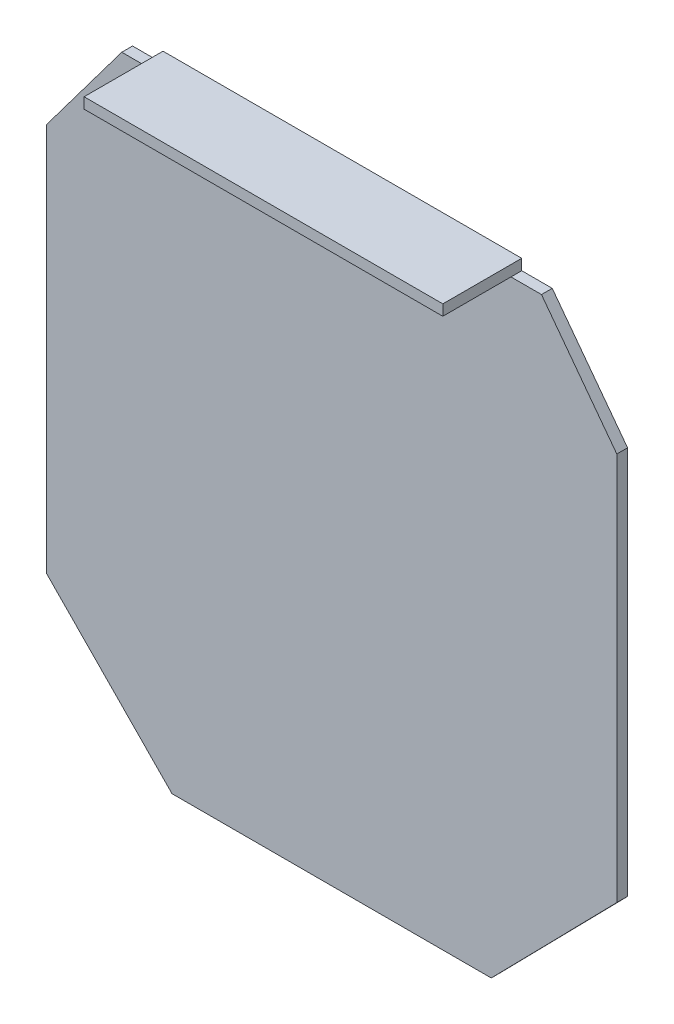
ISO-10303-21;
HEADER;
FILE_DESCRIPTION(('STEP AP214'),'2;1');
FILE_NAME('part.step','',(''),(''),'','','');
FILE_SCHEMA(('AUTOMOTIVE_DESIGN { 1 0 10303 214 1 1 1 1 }'));
ENDSEC;
DATA;
#1=APPLICATION_CONTEXT('core data for automotive mechanical design processes');
#2=APPLICATION_PROTOCOL_DEFINITION('international standard','automotive_design',2000,#1);
#3=PRODUCT_CONTEXT('',#1,'mechanical');
#4=PRODUCT('Part','Part','',(#3));
#5=PRODUCT_RELATED_PRODUCT_CATEGORY('part','',(#4));
#6=PRODUCT_DEFINITION_FORMATION('','',#4);
#7=PRODUCT_DEFINITION_CONTEXT('part definition',#1,'design');
#8=PRODUCT_DEFINITION('design','',#6,#7);
#9=PRODUCT_DEFINITION_SHAPE('','',#8);
#10=(LENGTH_UNIT() NAMED_UNIT(*) SI_UNIT(.MILLI.,.METRE.));
#11=(NAMED_UNIT(*) PLANE_ANGLE_UNIT() SI_UNIT($,.RADIAN.));
#12=(NAMED_UNIT(*) SI_UNIT($,.STERADIAN.) SOLID_ANGLE_UNIT());
#13=UNCERTAINTY_MEASURE_WITH_UNIT(LENGTH_MEASURE(1.E-05),#10,'distance_accuracy_value','');
#14=(GEOMETRIC_REPRESENTATION_CONTEXT(3) GLOBAL_UNCERTAINTY_ASSIGNED_CONTEXT((#13)) GLOBAL_UNIT_ASSIGNED_CONTEXT((#10,
#11,#12)) REPRESENTATION_CONTEXT('',''));
#15=CARTESIAN_POINT('',(0.,0.,0.));
#16=DIRECTION('',(0.,0.,1.));
#17=DIRECTION('',(1.,0.,0.));
#18=AXIS2_PLACEMENT_3D('',#15,#16,#17);
#19=CARTESIAN_POINT('',(58.5,86.,3.));
#20=DIRECTION('',(0.,-1.,0.));
#21=DIRECTION('',(1.,0.,0.));
#22=AXIS2_PLACEMENT_3D('',#19,#20,#21);
#23=PLANE('',#22);
#24=DIRECTION('',(0.,0.,-1.));
#25=VECTOR('',#24,1.);
#26=CARTESIAN_POINT('',(50.,86.,22.));
#27=LINE('',#26,#25);
#28=CARTESIAN_POINT('',(50.,86.,3.));
#29=VERTEX_POINT('',#28);
#30=CARTESIAN_POINT('',(50.,86.,0.));
#31=VERTEX_POINT('',#30);
#32=EDGE_CURVE('E11',#29,#31,#27,.T.);
#33=ORIENTED_EDGE('',*,*,#32,.F.);
#34=DIRECTION('',(-1.,0.,0.));
#35=VECTOR('',#34,1.);
#36=CARTESIAN_POINT('',(58.5,86.,3.));
#37=LINE('',#36,#35);
#38=CARTESIAN_POINT('',(58.5,86.,3.));
#39=VERTEX_POINT('',#38);
#40=EDGE_CURVE('E183',#39,#29,#37,.T.);
#41=ORIENTED_EDGE('',*,*,#40,.F.);
#42=DIRECTION('',(0.,0.,-1.));
#43=VECTOR('',#42,1.);
#44=CARTESIAN_POINT('',(58.5,86.,3.));
#45=LINE('',#44,#43);
#46=CARTESIAN_POINT('',(58.5,86.,0.));
#47=VERTEX_POINT('',#46);
#48=EDGE_CURVE('E202',#39,#47,#45,.T.);
#49=ORIENTED_EDGE('',*,*,#48,.T.);
#50=DIRECTION('',(-1.,0.,0.));
#51=VECTOR('',#50,1.);
#52=CARTESIAN_POINT('',(58.5,86.,0.));
#53=LINE('',#52,#51);
#54=EDGE_CURVE('E170',#47,#31,#53,.T.);
#55=ORIENTED_EDGE('',*,*,#54,.T.);
#56=EDGE_LOOP('',(#33,#41,#49,#55));
#57=FACE_BOUND('',#56,.T.);
#58=ADVANCED_FACE('F35',(#57),#23,.F.);
#59=DIRECTION('',(0.,0.,1.));
#60=VECTOR('',#59,1.);
#61=CARTESIAN_POINT('',(-50.,86.,22.));
#62=LINE('',#61,#60);
#63=CARTESIAN_POINT('',(-50.,86.,0.));
#64=VERTEX_POINT('',#63);
#65=CARTESIAN_POINT('',(-50.,86.,3.));
#66=VERTEX_POINT('',#65);
#67=EDGE_CURVE('E58',#64,#66,#62,.T.);
#68=ORIENTED_EDGE('',*,*,#67,.F.);
#69=CARTESIAN_POINT('',(-58.5,86.,0.));
#70=VERTEX_POINT('',#69);
#71=EDGE_CURVE('E198',#64,#70,#53,.T.);
#72=ORIENTED_EDGE('',*,*,#71,.T.);
#73=DIRECTION('',(0.,0.,-1.));
#74=VECTOR('',#73,1.);
#75=CARTESIAN_POINT('',(-58.5,86.,3.));
#76=LINE('',#75,#74);
#77=CARTESIAN_POINT('',(-58.5,86.,3.));
#78=VERTEX_POINT('',#77);
#79=EDGE_CURVE('E184',#78,#70,#76,.T.);
#80=ORIENTED_EDGE('',*,*,#79,.F.);
#81=EDGE_CURVE('E182',#66,#78,#37,.T.);
#82=ORIENTED_EDGE('',*,*,#81,.F.);
#83=EDGE_LOOP('',(#68,#72,#80,#82));
#84=FACE_BOUND('',#83,.T.);
#85=ADVANCED_FACE('F243',(#84),#23,.F.);
#86=CARTESIAN_POINT('',(-58.5,86.,3.));
#87=DIRECTION('',(0.8,-0.6,0.));
#88=DIRECTION('',(0.6,0.8,0.));
#89=AXIS2_PLACEMENT_3D('',#86,#87,#88);
#90=PLANE('',#89);
#91=DIRECTION('',(-0.6,-0.8,0.));
#92=VECTOR('',#91,1.);
#93=CARTESIAN_POINT('',(-58.5,86.,0.));
#94=LINE('',#93,#92);
#95=CARTESIAN_POINT('',(-79.5,58.,0.));
#96=VERTEX_POINT('',#95);
#97=EDGE_CURVE('E157',#70,#96,#94,.T.);
#98=ORIENTED_EDGE('',*,*,#97,.T.);
#99=DIRECTION('',(0.,0.,-1.));
#100=VECTOR('',#99,1.);
#101=CARTESIAN_POINT('',(-79.5,58.,3.));
#102=LINE('',#101,#100);
#103=CARTESIAN_POINT('',(-79.5,58.,3.));
#104=VERTEX_POINT('',#103);
#105=EDGE_CURVE('E39',#104,#96,#102,.T.);
#106=ORIENTED_EDGE('',*,*,#105,.F.);
#107=DIRECTION('',(-0.6,-0.8,0.));
#108=VECTOR('',#107,1.);
#109=CARTESIAN_POINT('',(-58.5,86.,3.));
#110=LINE('',#109,#108);
#111=EDGE_CURVE('E166',#78,#104,#110,.T.);
#112=ORIENTED_EDGE('',*,*,#111,.F.);
#113=ORIENTED_EDGE('',*,*,#79,.T.);
#114=EDGE_LOOP('',(#98,#106,#112,#113));
#115=FACE_BOUND('',#114,.T.);
#116=ADVANCED_FACE('F37',(#115),#90,.F.);
#117=CARTESIAN_POINT('',(-79.5,58.,3.));
#118=DIRECTION('',(1.,0.,0.));
#119=DIRECTION('',(0.,1.,0.));
#120=AXIS2_PLACEMENT_3D('',#117,#118,#119);
#121=PLANE('',#120);
#122=DIRECTION('',(0.,-1.,0.));
#123=VECTOR('',#122,1.);
#124=CARTESIAN_POINT('',(-79.5,58.,0.));
#125=LINE('',#124,#123);
#126=CARTESIAN_POINT('',(-79.5,-50.2928578572857,0.));
#127=VERTEX_POINT('',#126);
#128=EDGE_CURVE('E160',#96,#127,#125,.T.);
#129=ORIENTED_EDGE('',*,*,#128,.T.);
#130=DIRECTION('',(0.,0.,-1.));
#131=VECTOR('',#130,1.);
#132=CARTESIAN_POINT('',(-79.5,-50.2928578572857,3.));
#133=LINE('',#132,#131);
#134=CARTESIAN_POINT('',(-79.5,-50.2928578572857,3.));
#135=VERTEX_POINT('',#134);
#136=EDGE_CURVE('E216',#135,#127,#133,.T.);
#137=ORIENTED_EDGE('',*,*,#136,.F.);
#138=DIRECTION('',(0.,-1.,0.));
#139=VECTOR('',#138,1.);
#140=CARTESIAN_POINT('',(-79.5,58.,3.));
#141=LINE('',#140,#139);
#142=EDGE_CURVE('E169',#104,#135,#141,.T.);
#143=ORIENTED_EDGE('',*,*,#142,.F.);
#144=ORIENTED_EDGE('',*,*,#105,.T.);
#145=EDGE_LOOP('',(#129,#137,#143,#144));
#146=FACE_BOUND('',#145,.T.);
#147=ADVANCED_FACE('F225',(#146),#121,.F.);
#148=CARTESIAN_POINT('',(-79.5,-50.2928578572857,3.));
#149=DIRECTION('',(0.714142842854285,0.7,0.));
#150=DIRECTION('',(-0.7,0.714142842854285,0.));
#151=AXIS2_PLACEMENT_3D('',#148,#149,#150);
#152=PLANE('',#151);
#153=DIRECTION('',(0.7,-0.714142842854285,0.));
#154=VECTOR('',#153,1.);
#155=CARTESIAN_POINT('',(-79.5,-50.2928578572857,0.));
#156=LINE('',#155,#154);
#157=CARTESIAN_POINT('',(-44.5,-86.,0.));
#158=VERTEX_POINT('',#157);
#159=EDGE_CURVE('E188',#127,#158,#156,.T.);
#160=ORIENTED_EDGE('',*,*,#159,.T.);
#161=DIRECTION('',(0.,0.,-1.));
#162=VECTOR('',#161,1.);
#163=CARTESIAN_POINT('',(-44.5,-86.,3.));
#164=LINE('',#163,#162);
#165=CARTESIAN_POINT('',(-44.5,-86.,3.));
#166=VERTEX_POINT('',#165);
#167=EDGE_CURVE('E214',#166,#158,#164,.T.);
#168=ORIENTED_EDGE('',*,*,#167,.F.);
#169=DIRECTION('',(0.7,-0.714142842854285,0.));
#170=VECTOR('',#169,1.);
#171=CARTESIAN_POINT('',(-79.5,-50.2928578572857,3.));
#172=LINE('',#171,#170);
#173=EDGE_CURVE('E172',#135,#166,#172,.T.);
#174=ORIENTED_EDGE('',*,*,#173,.F.);
#175=ORIENTED_EDGE('',*,*,#136,.T.);
#176=EDGE_LOOP('',(#160,#168,#174,#175));
#177=FACE_BOUND('',#176,.T.);
#178=ADVANCED_FACE('F232',(#177),#152,.F.);
#179=CARTESIAN_POINT('',(-44.5,-86.,3.));
#180=DIRECTION('',(0.,1.,0.));
#181=DIRECTION('',(-1.,0.,0.));
#182=AXIS2_PLACEMENT_3D('',#179,#180,#181);
#183=PLANE('',#182);
#184=DIRECTION('',(1.,0.,0.));
#185=VECTOR('',#184,1.);
#186=CARTESIAN_POINT('',(-44.5,-86.,0.));
#187=LINE('',#186,#185);
#188=CARTESIAN_POINT('',(44.5,-86.,0.));
#189=VERTEX_POINT('',#188);
#190=EDGE_CURVE('E190',#158,#189,#187,.T.);
#191=ORIENTED_EDGE('',*,*,#190,.T.);
#192=DIRECTION('',(0.,0.,-1.));
#193=VECTOR('',#192,1.);
#194=CARTESIAN_POINT('',(44.5,-86.,3.));
#195=LINE('',#194,#193);
#196=CARTESIAN_POINT('',(44.5,-86.,3.));
#197=VERTEX_POINT('',#196);
#198=EDGE_CURVE('E211',#197,#189,#195,.T.);
#199=ORIENTED_EDGE('',*,*,#198,.F.);
#200=DIRECTION('',(1.,0.,0.));
#201=VECTOR('',#200,1.);
#202=CARTESIAN_POINT('',(-44.5,-86.,3.));
#203=LINE('',#202,#201);
#204=EDGE_CURVE('E174',#166,#197,#203,.T.);
#205=ORIENTED_EDGE('',*,*,#204,.F.);
#206=ORIENTED_EDGE('',*,*,#167,.T.);
#207=EDGE_LOOP('',(#191,#199,#205,#206));
#208=FACE_BOUND('',#207,.T.);
#209=ADVANCED_FACE('F235',(#208),#183,.F.);
#210=CARTESIAN_POINT('',(44.5,-86.,3.));
#211=DIRECTION('',(-0.714142842854285,0.7,0.));
#212=DIRECTION('',(-0.7,-0.714142842854285,0.));
#213=AXIS2_PLACEMENT_3D('',#210,#211,#212);
#214=PLANE('',#213);
#215=DIRECTION('',(0.7,0.714142842854285,0.));
#216=VECTOR('',#215,1.);
#217=CARTESIAN_POINT('',(44.5,-86.,0.));
#218=LINE('',#217,#216);
#219=CARTESIAN_POINT('',(79.5,-50.2928578572858,0.));
#220=VERTEX_POINT('',#219);
#221=EDGE_CURVE('E192',#189,#220,#218,.T.);
#222=ORIENTED_EDGE('',*,*,#221,.T.);
#223=DIRECTION('',(0.,0.,-1.));
#224=VECTOR('',#223,1.);
#225=CARTESIAN_POINT('',(79.5,-50.2928578572858,3.));
#226=LINE('',#225,#224);
#227=CARTESIAN_POINT('',(79.5,-50.2928578572858,3.));
#228=VERTEX_POINT('',#227);
#229=EDGE_CURVE('E208',#228,#220,#226,.T.);
#230=ORIENTED_EDGE('',*,*,#229,.F.);
#231=DIRECTION('',(0.7,0.714142842854285,0.));
#232=VECTOR('',#231,1.);
#233=CARTESIAN_POINT('',(44.5,-86.,3.));
#234=LINE('',#233,#232);
#235=EDGE_CURVE('E176',#197,#228,#234,.T.);
#236=ORIENTED_EDGE('',*,*,#235,.F.);
#237=ORIENTED_EDGE('',*,*,#198,.T.);
#238=EDGE_LOOP('',(#222,#230,#236,#237));
#239=FACE_BOUND('',#238,.T.);
#240=ADVANCED_FACE('F260',(#239),#214,.F.);
#241=CARTESIAN_POINT('',(79.5,-50.2928578572858,3.));
#242=DIRECTION('',(-1.,0.,0.));
#243=DIRECTION('',(0.,0.,1.));
#244=AXIS2_PLACEMENT_3D('',#241,#242,#243);
#245=PLANE('',#244);
#246=DIRECTION('',(0.,1.,0.));
#247=VECTOR('',#246,1.);
#248=CARTESIAN_POINT('',(79.5,-50.2928578572858,0.));
#249=LINE('',#248,#247);
#250=CARTESIAN_POINT('',(79.5,58.,0.));
#251=VERTEX_POINT('',#250);
#252=EDGE_CURVE('E194',#220,#251,#249,.T.);
#253=ORIENTED_EDGE('',*,*,#252,.T.);
#254=DIRECTION('',(0.,0.,-1.));
#255=VECTOR('',#254,1.);
#256=CARTESIAN_POINT('',(79.5,58.,3.));
#257=LINE('',#256,#255);
#258=CARTESIAN_POINT('',(79.5,58.,3.));
#259=VERTEX_POINT('',#258);
#260=EDGE_CURVE('E205',#259,#251,#257,.T.);
#261=ORIENTED_EDGE('',*,*,#260,.F.);
#262=DIRECTION('',(0.,1.,0.));
#263=VECTOR('',#262,1.);
#264=CARTESIAN_POINT('',(79.5,-50.2928578572858,3.));
#265=LINE('',#264,#263);
#266=EDGE_CURVE('E178',#228,#259,#265,.T.);
#267=ORIENTED_EDGE('',*,*,#266,.F.);
#268=ORIENTED_EDGE('',*,*,#229,.T.);
#269=EDGE_LOOP('',(#253,#261,#267,#268));
#270=FACE_BOUND('',#269,.T.);
#271=ADVANCED_FACE('F256',(#270),#245,.F.);
#272=CARTESIAN_POINT('',(79.5,58.,3.));
#273=DIRECTION('',(-0.800000000000001,-0.599999999999999,0.));
#274=DIRECTION('',(0.599999999999999,-0.800000000000001,0.));
#275=AXIS2_PLACEMENT_3D('',#272,#273,#274);
#276=PLANE('',#275);
#277=DIRECTION('',(-0.599999999999999,0.800000000000001,0.));
#278=VECTOR('',#277,1.);
#279=CARTESIAN_POINT('',(79.5,58.,0.));
#280=LINE('',#279,#278);
#281=EDGE_CURVE('E196',#251,#47,#280,.T.);
#282=ORIENTED_EDGE('',*,*,#281,.T.);
#283=ORIENTED_EDGE('',*,*,#48,.F.);
#284=DIRECTION('',(-0.599999999999999,0.800000000000001,0.));
#285=VECTOR('',#284,1.);
#286=CARTESIAN_POINT('',(79.5,58.,3.));
#287=LINE('',#286,#285);
#288=EDGE_CURVE('E180',#259,#39,#287,.T.);
#289=ORIENTED_EDGE('',*,*,#288,.F.);
#290=ORIENTED_EDGE('',*,*,#260,.T.);
#291=EDGE_LOOP('',(#282,#283,#289,#290));
#292=FACE_BOUND('',#291,.T.);
#293=ADVANCED_FACE('F253',(#292),#276,.F.);
#294=CARTESIAN_POINT('',(0.,0.,3.));
#295=DIRECTION('',(0.,0.,1.));
#296=DIRECTION('',(1.,0.,0.));
#297=AXIS2_PLACEMENT_3D('',#294,#295,#296);
#298=PLANE('',#297);
#299=ORIENTED_EDGE('',*,*,#111,.T.);
#300=ORIENTED_EDGE('',*,*,#142,.T.);
#301=ORIENTED_EDGE('',*,*,#173,.T.);
#302=ORIENTED_EDGE('',*,*,#204,.T.);
#303=ORIENTED_EDGE('',*,*,#235,.T.);
#304=ORIENTED_EDGE('',*,*,#266,.T.);
#305=ORIENTED_EDGE('',*,*,#288,.T.);
#306=ORIENTED_EDGE('',*,*,#40,.T.);
#307=EDGE_CURVE('E185',#29,#66,#37,.T.);
#308=ORIENTED_EDGE('',*,*,#307,.T.);
#309=ORIENTED_EDGE('',*,*,#81,.T.);
#310=EDGE_LOOP('',(#299,#300,#301,#302,#303,#304,#305,#306,#308,#309));
#311=FACE_BOUND('',#310,.T.);
#312=ADVANCED_FACE('F239',(#311),#298,.T.);
#313=CARTESIAN_POINT('',(0.,0.,0.));
#314=DIRECTION('',(0.,0.,1.));
#315=DIRECTION('',(1.,0.,0.));
#316=AXIS2_PLACEMENT_3D('',#313,#314,#315);
#317=PLANE('',#316);
#318=ORIENTED_EDGE('',*,*,#97,.F.);
#319=ORIENTED_EDGE('',*,*,#71,.F.);
#320=DIRECTION('',(0.,-1.,0.));
#321=VECTOR('',#320,1.);
#322=CARTESIAN_POINT('',(-50.,89.,0.));
#323=LINE('',#322,#321);
#324=CARTESIAN_POINT('',(-50.,89.,0.));
#325=VERTEX_POINT('',#324);
#326=EDGE_CURVE('E140',#325,#64,#323,.T.);
#327=ORIENTED_EDGE('',*,*,#326,.F.);
#328=DIRECTION('',(-1.,0.,0.));
#329=VECTOR('',#328,1.);
#330=CARTESIAN_POINT('',(-50.,89.,0.));
#331=LINE('',#330,#329);
#332=CARTESIAN_POINT('',(50.,89.0000000000001,0.));
#333=VERTEX_POINT('',#332);
#334=EDGE_CURVE('E132',#333,#325,#331,.T.);
#335=ORIENTED_EDGE('',*,*,#334,.F.);
#336=DIRECTION('',(0.,-1.,0.));
#337=VECTOR('',#336,1.);
#338=CARTESIAN_POINT('',(50.,89.0000000000001,0.));
#339=LINE('',#338,#337);
#340=EDGE_CURVE('E138',#333,#31,#339,.T.);
#341=ORIENTED_EDGE('',*,*,#340,.T.);
#342=ORIENTED_EDGE('',*,*,#54,.F.);
#343=ORIENTED_EDGE('',*,*,#281,.F.);
#344=ORIENTED_EDGE('',*,*,#252,.F.);
#345=ORIENTED_EDGE('',*,*,#221,.F.);
#346=ORIENTED_EDGE('',*,*,#190,.F.);
#347=ORIENTED_EDGE('',*,*,#159,.F.);
#348=ORIENTED_EDGE('',*,*,#128,.F.);
#349=EDGE_LOOP('',(#318,#319,#327,#335,#341,#342,#343,#344,#345,#346,#347,#348));
#350=FACE_BOUND('',#349,.T.);
#351=ADVANCED_FACE('F135',(#350),#317,.F.);
#352=CARTESIAN_POINT('',(0.,86.,0.));
#353=DIRECTION('',(0.,-1.,0.));
#354=DIRECTION('',(1.,0.,0.));
#355=AXIS2_PLACEMENT_3D('',#352,#353,#354);
#356=PLANE('',#355);
#357=ORIENTED_EDGE('',*,*,#307,.F.);
#358=CARTESIAN_POINT('',(50.,86.,22.));
#359=VERTEX_POINT('',#358);
#360=EDGE_CURVE('E45',#359,#29,#27,.T.);
#361=ORIENTED_EDGE('',*,*,#360,.F.);
#362=DIRECTION('',(1.,0.,0.));
#363=VECTOR('',#362,1.);
#364=CARTESIAN_POINT('',(-50.,86.,22.));
#365=LINE('',#364,#363);
#366=CARTESIAN_POINT('',(-50.,86.,22.));
#367=VERTEX_POINT('',#366);
#368=EDGE_CURVE('E153',#367,#359,#365,.T.);
#369=ORIENTED_EDGE('',*,*,#368,.F.);
#370=EDGE_CURVE('E391',#66,#367,#62,.T.);
#371=ORIENTED_EDGE('',*,*,#370,.F.);
#372=EDGE_LOOP('',(#357,#361,#369,#371));
#373=FACE_BOUND('',#372,.T.);
#374=ADVANCED_FACE('F305',(#373),#356,.T.);
#375=CARTESIAN_POINT('',(50.,89.0000000000001,22.));
#376=DIRECTION('',(-1.,0.,0.));
#377=DIRECTION('',(0.,-1.,0.));
#378=AXIS2_PLACEMENT_3D('',#375,#376,#377);
#379=PLANE('',#378);
#380=ORIENTED_EDGE('',*,*,#360,.T.);
#381=ORIENTED_EDGE('',*,*,#32,.T.);
#382=ORIENTED_EDGE('',*,*,#340,.F.);
#383=DIRECTION('',(0.,0.,-1.));
#384=VECTOR('',#383,1.);
#385=CARTESIAN_POINT('',(50.,89.0000000000001,22.));
#386=LINE('',#385,#384);
#387=CARTESIAN_POINT('',(50.,89.0000000000001,22.));
#388=VERTEX_POINT('',#387);
#389=EDGE_CURVE('E144',#388,#333,#386,.T.);
#390=ORIENTED_EDGE('',*,*,#389,.F.);
#391=DIRECTION('',(0.,-1.,0.));
#392=VECTOR('',#391,1.);
#393=CARTESIAN_POINT('',(50.,89.0000000000001,22.));
#394=LINE('',#393,#392);
#395=EDGE_CURVE('E386',#388,#359,#394,.T.);
#396=ORIENTED_EDGE('',*,*,#395,.T.);
#397=EDGE_LOOP('',(#380,#381,#382,#390,#396));
#398=FACE_BOUND('',#397,.T.);
#399=ADVANCED_FACE('F156',(#398),#379,.F.);
#400=CARTESIAN_POINT('',(-50.,89.,22.));
#401=DIRECTION('',(1.,0.,0.));
#402=DIRECTION('',(0.,1.,0.));
#403=AXIS2_PLACEMENT_3D('',#400,#401,#402);
#404=PLANE('',#403);
#405=ORIENTED_EDGE('',*,*,#67,.T.);
#406=ORIENTED_EDGE('',*,*,#370,.T.);
#407=DIRECTION('',(0.,-1.,0.));
#408=VECTOR('',#407,1.);
#409=CARTESIAN_POINT('',(-50.,89.,22.));
#410=LINE('',#409,#408);
#411=CARTESIAN_POINT('',(-50.,89.,22.));
#412=VERTEX_POINT('',#411);
#413=EDGE_CURVE('E162',#412,#367,#410,.T.);
#414=ORIENTED_EDGE('',*,*,#413,.F.);
#415=DIRECTION('',(0.,0.,1.));
#416=VECTOR('',#415,1.);
#417=CARTESIAN_POINT('',(-50.,89.,22.));
#418=LINE('',#417,#416);
#419=EDGE_CURVE('E143',#325,#412,#418,.T.);
#420=ORIENTED_EDGE('',*,*,#419,.F.);
#421=ORIENTED_EDGE('',*,*,#326,.T.);
#422=EDGE_LOOP('',(#405,#406,#414,#420,#421));
#423=FACE_BOUND('',#422,.T.);
#424=ADVANCED_FACE('F318',(#423),#404,.F.);
#425=CARTESIAN_POINT('',(-50.,89.,22.));
#426=DIRECTION('',(0.,0.,-1.));
#427=DIRECTION('',(-1.,0.,0.));
#428=AXIS2_PLACEMENT_3D('',#425,#426,#427);
#429=PLANE('',#428);
#430=ORIENTED_EDGE('',*,*,#368,.T.);
#431=ORIENTED_EDGE('',*,*,#395,.F.);
#432=DIRECTION('',(1.,0.,0.));
#433=VECTOR('',#432,1.);
#434=CARTESIAN_POINT('',(-50.,89.,22.));
#435=LINE('',#434,#433);
#436=EDGE_CURVE('E149',#412,#388,#435,.T.);
#437=ORIENTED_EDGE('',*,*,#436,.F.);
#438=ORIENTED_EDGE('',*,*,#413,.T.);
#439=EDGE_LOOP('',(#430,#431,#437,#438));
#440=FACE_BOUND('',#439,.T.);
#441=ADVANCED_FACE('F325',(#440),#429,.F.);
#442=CARTESIAN_POINT('',(0.,89.,0.));
#443=DIRECTION('',(0.,-1.,0.));
#444=DIRECTION('',(1.,0.,0.));
#445=AXIS2_PLACEMENT_3D('',#442,#443,#444);
#446=PLANE('',#445);
#447=ORIENTED_EDGE('',*,*,#389,.T.);
#448=ORIENTED_EDGE('',*,*,#334,.T.);
#449=ORIENTED_EDGE('',*,*,#419,.T.);
#450=ORIENTED_EDGE('',*,*,#436,.T.);
#451=EDGE_LOOP('',(#447,#448,#449,#450));
#452=FACE_BOUND('',#451,.T.);
#453=ADVANCED_FACE('F147',(#452),#446,.F.);
#454=CLOSED_SHELL('',(#58,#85,#116,#147,#178,#209,#240,#271,#293,#312,#351,#374,#399,#424,#441,#453));
#455=MANIFOLD_SOLID_BREP('B2',#454);
#456=ADVANCED_BREP_SHAPE_REPRESENTATION('',(#18,#455),#14);
#457=SHAPE_DEFINITION_REPRESENTATION(#9,#456);
ENDSEC;
END-ISO-10303-21;
